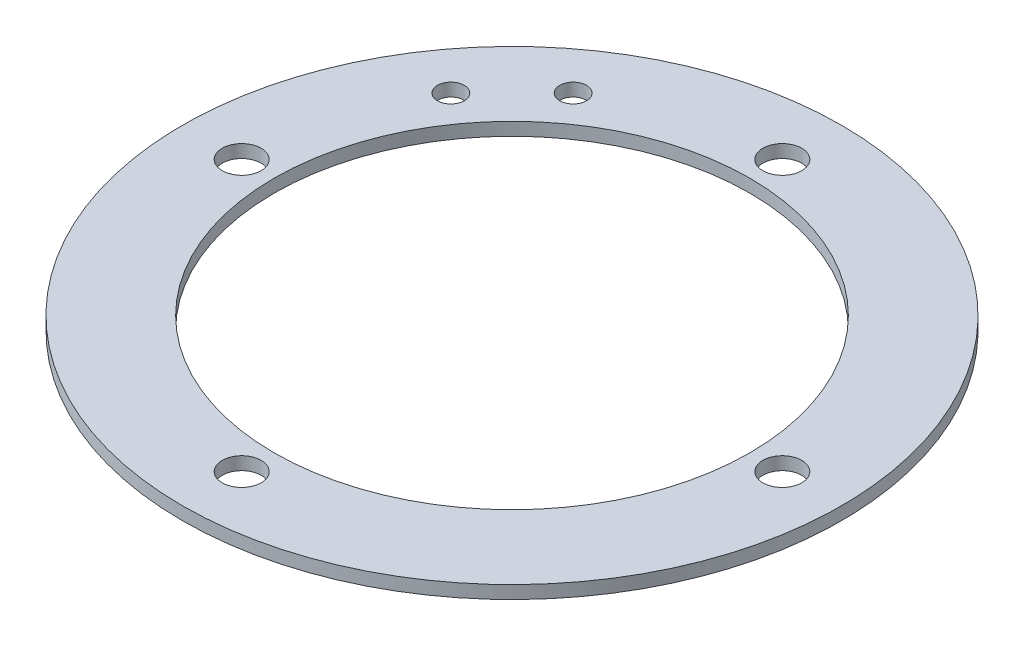
ISO-10303-21;
HEADER;
FILE_DESCRIPTION(('STEP AP214'),'2;1');
FILE_NAME('part.step','',(''),(''),'','','');
FILE_SCHEMA(('AUTOMOTIVE_DESIGN { 1 0 10303 214 1 1 1 1 }'));
ENDSEC;
DATA;
#1=APPLICATION_CONTEXT('core data for automotive mechanical design processes');
#2=APPLICATION_PROTOCOL_DEFINITION('international standard','automotive_design',2000,#1);
#3=PRODUCT_CONTEXT('',#1,'mechanical');
#4=PRODUCT('Part','Part','',(#3));
#5=PRODUCT_RELATED_PRODUCT_CATEGORY('part','',(#4));
#6=PRODUCT_DEFINITION_FORMATION('','',#4);
#7=PRODUCT_DEFINITION_CONTEXT('part definition',#1,'design');
#8=PRODUCT_DEFINITION('design','',#6,#7);
#9=PRODUCT_DEFINITION_SHAPE('','',#8);
#10=(LENGTH_UNIT() NAMED_UNIT(*) SI_UNIT(.MILLI.,.METRE.));
#11=(NAMED_UNIT(*) PLANE_ANGLE_UNIT() SI_UNIT($,.RADIAN.));
#12=(NAMED_UNIT(*) SI_UNIT($,.STERADIAN.) SOLID_ANGLE_UNIT());
#13=UNCERTAINTY_MEASURE_WITH_UNIT(LENGTH_MEASURE(1.E-05),#10,'distance_accuracy_value','');
#14=(GEOMETRIC_REPRESENTATION_CONTEXT(3) GLOBAL_UNCERTAINTY_ASSIGNED_CONTEXT((#13)) GLOBAL_UNIT_ASSIGNED_CONTEXT((#10,
#11,#12)) REPRESENTATION_CONTEXT('',''));
#15=CARTESIAN_POINT('',(0.,0.,0.));
#16=DIRECTION('',(0.,0.,1.));
#17=DIRECTION('',(1.,0.,0.));
#18=AXIS2_PLACEMENT_3D('',#15,#16,#17);
#19=CARTESIAN_POINT('',(0.,3.,0.));
#20=DIRECTION('',(0.,1.,0.));
#21=DIRECTION('',(0.,0.,1.));
#22=AXIS2_PLACEMENT_3D('',#19,#20,#21);
#23=PLANE('',#22);
#24=CARTESIAN_POINT('',(-51.6187950266179,3.,-37.4766594028871));
#25=DIRECTION('',(0.,1.,0.));
#26=DIRECTION('',(0.,0.,1.));
#27=AXIS2_PLACEMENT_3D('',#24,#25,#26);
#28=CIRCLE('',#27,3.09999999999999);
#29=CARTESIAN_POINT('',(-51.6187950266179,3.,-34.3766594028871));
#30=VERTEX_POINT('',#29);
#31=EDGE_CURVE('E84',#30,#30,#28,.T.);
#32=ORIENTED_EDGE('',*,*,#31,.F.);
#33=EDGE_LOOP('',(#32));
#34=FACE_BOUND('',#33,.T.);
#35=CARTESIAN_POINT('',(-37.4766594028869,3.,-51.618795026618));
#36=DIRECTION('',(0.,1.,0.));
#37=DIRECTION('',(0.,0.,1.));
#38=AXIS2_PLACEMENT_3D('',#35,#36,#37);
#39=CIRCLE('',#38,3.09999999999999);
#40=CARTESIAN_POINT('',(-37.4766594028869,3.,-48.518795026618));
#41=VERTEX_POINT('',#40);
#42=EDGE_CURVE('E78',#41,#41,#39,.T.);
#43=ORIENTED_EDGE('',*,*,#42,.F.);
#44=EDGE_LOOP('',(#43));
#45=FACE_BOUND('',#44,.T.);
#46=CARTESIAN_POINT('',(0.,3.,62.5));
#47=DIRECTION('',(0.,1.,0.));
#48=DIRECTION('',(0.,0.,1.));
#49=AXIS2_PLACEMENT_3D('',#46,#47,#48);
#50=CIRCLE('',#49,4.5);
#51=CARTESIAN_POINT('',(0.,3.,67.));
#52=VERTEX_POINT('',#51);
#53=EDGE_CURVE('E63',#52,#52,#50,.T.);
#54=ORIENTED_EDGE('',*,*,#53,.F.);
#55=EDGE_LOOP('',(#54));
#56=FACE_BOUND('',#55,.T.);
#57=CARTESIAN_POINT('',(0.,3.,0.));
#58=DIRECTION('',(0.,1.,0.));
#59=DIRECTION('',(0.,0.,1.));
#60=AXIS2_PLACEMENT_3D('',#57,#58,#59);
#61=CIRCLE('',#60,55.);
#62=CARTESIAN_POINT('',(0.,3.,55.));
#63=VERTEX_POINT('',#62);
#64=EDGE_CURVE('E51',#63,#63,#61,.T.);
#65=ORIENTED_EDGE('',*,*,#64,.F.);
#66=EDGE_LOOP('',(#65));
#67=FACE_BOUND('',#66,.T.);
#68=CARTESIAN_POINT('',(0.,3.,0.));
#69=DIRECTION('',(0.,1.,0.));
#70=DIRECTION('',(0.,0.,1.));
#71=AXIS2_PLACEMENT_3D('',#68,#69,#70);
#72=CIRCLE('',#71,76.2);
#73=CARTESIAN_POINT('',(0.,3.,76.2));
#74=VERTEX_POINT('',#73);
#75=EDGE_CURVE('E10',#74,#74,#72,.T.);
#76=ORIENTED_EDGE('',*,*,#75,.T.);
#77=EDGE_LOOP('',(#76));
#78=FACE_BOUND('',#77,.T.);
#79=CARTESIAN_POINT('',(0.,3.,-62.5));
#80=DIRECTION('',(0.,1.,0.));
#81=DIRECTION('',(0.,0.,1.));
#82=AXIS2_PLACEMENT_3D('',#79,#80,#81);
#83=CIRCLE('',#82,4.5);
#84=CARTESIAN_POINT('',(0.,3.,-58.));
#85=VERTEX_POINT('',#84);
#86=EDGE_CURVE('E46',#85,#85,#83,.T.);
#87=ORIENTED_EDGE('',*,*,#86,.F.);
#88=EDGE_LOOP('',(#87));
#89=FACE_BOUND('',#88,.T.);
#90=CARTESIAN_POINT('',(62.5,3.,0.));
#91=DIRECTION('',(0.,1.,0.));
#92=DIRECTION('',(0.,0.,1.));
#93=AXIS2_PLACEMENT_3D('',#90,#91,#92);
#94=CIRCLE('',#93,4.5);
#95=CARTESIAN_POINT('',(62.5,3.,4.5));
#96=VERTEX_POINT('',#95);
#97=EDGE_CURVE('E57',#96,#96,#94,.T.);
#98=ORIENTED_EDGE('',*,*,#97,.F.);
#99=EDGE_LOOP('',(#98));
#100=FACE_BOUND('',#99,.T.);
#101=CARTESIAN_POINT('',(-62.5,3.,0.));
#102=DIRECTION('',(0.,1.,0.));
#103=DIRECTION('',(0.,0.,1.));
#104=AXIS2_PLACEMENT_3D('',#101,#102,#103);
#105=CIRCLE('',#104,4.5);
#106=CARTESIAN_POINT('',(-62.5,3.,4.49999999999999));
#107=VERTEX_POINT('',#106);
#108=EDGE_CURVE('E69',#107,#107,#105,.T.);
#109=ORIENTED_EDGE('',*,*,#108,.F.);
#110=EDGE_LOOP('',(#109));
#111=FACE_BOUND('',#110,.T.);
#112=ADVANCED_FACE('F35',(#34,#45,#56,#67,#78,#89,#100,#111),#23,.T.);
#113=CARTESIAN_POINT('',(0.,0.,0.));
#114=DIRECTION('',(0.,1.,0.));
#115=DIRECTION('',(0.,0.,1.));
#116=AXIS2_PLACEMENT_3D('',#113,#114,#115);
#117=PLANE('',#116);
#118=CARTESIAN_POINT('',(-51.6187950266179,0.,-37.4766594028871));
#119=DIRECTION('',(0.,1.,0.));
#120=DIRECTION('',(0.,0.,1.));
#121=AXIS2_PLACEMENT_3D('',#118,#119,#120);
#122=CIRCLE('',#121,3.09999999999999);
#123=CARTESIAN_POINT('',(-51.6187950266179,0.,-34.3766594028871));
#124=VERTEX_POINT('',#123);
#125=EDGE_CURVE('E75',#124,#124,#122,.T.);
#126=ORIENTED_EDGE('',*,*,#125,.T.);
#127=EDGE_LOOP('',(#126));
#128=FACE_BOUND('',#127,.T.);
#129=CARTESIAN_POINT('',(-37.4766594028869,0.,-51.618795026618));
#130=DIRECTION('',(0.,1.,0.));
#131=DIRECTION('',(0.,0.,1.));
#132=AXIS2_PLACEMENT_3D('',#129,#130,#131);
#133=CIRCLE('',#132,3.09999999999999);
#134=CARTESIAN_POINT('',(-37.4766594028869,0.,-48.518795026618));
#135=VERTEX_POINT('',#134);
#136=EDGE_CURVE('E81',#135,#135,#133,.T.);
#137=ORIENTED_EDGE('',*,*,#136,.T.);
#138=EDGE_LOOP('',(#137));
#139=FACE_BOUND('',#138,.T.);
#140=CARTESIAN_POINT('',(0.,0.,0.));
#141=DIRECTION('',(0.,1.,0.));
#142=DIRECTION('',(0.,0.,1.));
#143=AXIS2_PLACEMENT_3D('',#140,#141,#142);
#144=CIRCLE('',#143,76.2);
#145=CARTESIAN_POINT('',(0.,0.,76.2));
#146=VERTEX_POINT('',#145);
#147=EDGE_CURVE('E39',#146,#146,#144,.T.);
#148=ORIENTED_EDGE('',*,*,#147,.F.);
#149=EDGE_LOOP('',(#148));
#150=FACE_BOUND('',#149,.T.);
#151=CARTESIAN_POINT('',(0.,0.,-62.5));
#152=DIRECTION('',(0.,1.,0.));
#153=DIRECTION('',(0.,0.,1.));
#154=AXIS2_PLACEMENT_3D('',#151,#152,#153);
#155=CIRCLE('',#154,4.5);
#156=CARTESIAN_POINT('',(0.,0.,-58.));
#157=VERTEX_POINT('',#156);
#158=EDGE_CURVE('E48',#157,#157,#155,.T.);
#159=ORIENTED_EDGE('',*,*,#158,.T.);
#160=EDGE_LOOP('',(#159));
#161=FACE_BOUND('',#160,.T.);
#162=CARTESIAN_POINT('',(0.,0.,0.));
#163=DIRECTION('',(0.,1.,0.));
#164=DIRECTION('',(0.,0.,1.));
#165=AXIS2_PLACEMENT_3D('',#162,#163,#164);
#166=CIRCLE('',#165,55.);
#167=CARTESIAN_POINT('',(0.,0.,55.));
#168=VERTEX_POINT('',#167);
#169=EDGE_CURVE('E54',#168,#168,#166,.T.);
#170=ORIENTED_EDGE('',*,*,#169,.T.);
#171=EDGE_LOOP('',(#170));
#172=FACE_BOUND('',#171,.T.);
#173=CARTESIAN_POINT('',(62.5,0.,0.));
#174=DIRECTION('',(0.,1.,0.));
#175=DIRECTION('',(0.,0.,1.));
#176=AXIS2_PLACEMENT_3D('',#173,#174,#175);
#177=CIRCLE('',#176,4.5);
#178=CARTESIAN_POINT('',(62.5,0.,4.5));
#179=VERTEX_POINT('',#178);
#180=EDGE_CURVE('E60',#179,#179,#177,.T.);
#181=ORIENTED_EDGE('',*,*,#180,.T.);
#182=EDGE_LOOP('',(#181));
#183=FACE_BOUND('',#182,.T.);
#184=CARTESIAN_POINT('',(0.,0.,62.5));
#185=DIRECTION('',(0.,1.,0.));
#186=DIRECTION('',(0.,0.,1.));
#187=AXIS2_PLACEMENT_3D('',#184,#185,#186);
#188=CIRCLE('',#187,4.5);
#189=CARTESIAN_POINT('',(0.,0.,67.));
#190=VERTEX_POINT('',#189);
#191=EDGE_CURVE('E66',#190,#190,#188,.T.);
#192=ORIENTED_EDGE('',*,*,#191,.T.);
#193=EDGE_LOOP('',(#192));
#194=FACE_BOUND('',#193,.T.);
#195=CARTESIAN_POINT('',(-62.5,0.,0.));
#196=DIRECTION('',(0.,1.,0.));
#197=DIRECTION('',(0.,0.,1.));
#198=AXIS2_PLACEMENT_3D('',#195,#196,#197);
#199=CIRCLE('',#198,4.5);
#200=CARTESIAN_POINT('',(-62.5,0.,4.49999999999999));
#201=VERTEX_POINT('',#200);
#202=EDGE_CURVE('E72',#201,#201,#199,.T.);
#203=ORIENTED_EDGE('',*,*,#202,.T.);
#204=EDGE_LOOP('',(#203));
#205=FACE_BOUND('',#204,.T.);
#206=ADVANCED_FACE('F90',(#128,#139,#150,#161,#172,#183,#194,#205),#117,.F.);
#207=CARTESIAN_POINT('',(0.,3.,0.));
#208=DIRECTION('',(0.,-1.,0.));
#209=DIRECTION('',(0.,0.,-1.));
#210=AXIS2_PLACEMENT_3D('',#207,#208,#209);
#211=CYLINDRICAL_SURFACE('',#210,76.2);
#212=ORIENTED_EDGE('',*,*,#75,.F.);
#213=EDGE_LOOP('',(#212));
#214=FACE_BOUND('',#213,.T.);
#215=ORIENTED_EDGE('',*,*,#147,.T.);
#216=EDGE_LOOP('',(#215));
#217=FACE_BOUND('',#216,.T.);
#218=ADVANCED_FACE('F37',(#214,#217),#211,.T.);
#219=CARTESIAN_POINT('',(0.,3.,-62.5));
#220=DIRECTION('',(0.,-1.,0.));
#221=DIRECTION('',(0.,0.,-1.));
#222=AXIS2_PLACEMENT_3D('',#219,#220,#221);
#223=CYLINDRICAL_SURFACE('',#222,4.5);
#224=ORIENTED_EDGE('',*,*,#86,.T.);
#225=EDGE_LOOP('',(#224));
#226=FACE_BOUND('',#225,.T.);
#227=ORIENTED_EDGE('',*,*,#158,.F.);
#228=EDGE_LOOP('',(#227));
#229=FACE_BOUND('',#228,.T.);
#230=ADVANCED_FACE('F126',(#226,#229),#223,.F.);
#231=CARTESIAN_POINT('',(0.,3.,0.));
#232=DIRECTION('',(0.,-1.,0.));
#233=DIRECTION('',(0.,0.,-1.));
#234=AXIS2_PLACEMENT_3D('',#231,#232,#233);
#235=CYLINDRICAL_SURFACE('',#234,55.);
#236=ORIENTED_EDGE('',*,*,#64,.T.);
#237=EDGE_LOOP('',(#236));
#238=FACE_BOUND('',#237,.T.);
#239=ORIENTED_EDGE('',*,*,#169,.F.);
#240=EDGE_LOOP('',(#239));
#241=FACE_BOUND('',#240,.T.);
#242=ADVANCED_FACE('F131',(#238,#241),#235,.F.);
#243=CARTESIAN_POINT('',(62.5,3.,0.));
#244=DIRECTION('',(0.,-1.,0.));
#245=DIRECTION('',(0.,0.,-1.));
#246=AXIS2_PLACEMENT_3D('',#243,#244,#245);
#247=CYLINDRICAL_SURFACE('',#246,4.5);
#248=ORIENTED_EDGE('',*,*,#97,.T.);
#249=EDGE_LOOP('',(#248));
#250=FACE_BOUND('',#249,.T.);
#251=ORIENTED_EDGE('',*,*,#180,.F.);
#252=EDGE_LOOP('',(#251));
#253=FACE_BOUND('',#252,.T.);
#254=ADVANCED_FACE('F135',(#250,#253),#247,.F.);
#255=CARTESIAN_POINT('',(0.,3.,62.5));
#256=DIRECTION('',(0.,-1.,0.));
#257=DIRECTION('',(0.,0.,-1.));
#258=AXIS2_PLACEMENT_3D('',#255,#256,#257);
#259=CYLINDRICAL_SURFACE('',#258,4.5);
#260=ORIENTED_EDGE('',*,*,#53,.T.);
#261=EDGE_LOOP('',(#260));
#262=FACE_BOUND('',#261,.T.);
#263=ORIENTED_EDGE('',*,*,#191,.F.);
#264=EDGE_LOOP('',(#263));
#265=FACE_BOUND('',#264,.T.);
#266=ADVANCED_FACE('F118',(#262,#265),#259,.F.);
#267=CARTESIAN_POINT('',(-62.5,3.,0.));
#268=DIRECTION('',(0.,-1.,0.));
#269=DIRECTION('',(0.,0.,-1.));
#270=AXIS2_PLACEMENT_3D('',#267,#268,#269);
#271=CYLINDRICAL_SURFACE('',#270,4.5);
#272=ORIENTED_EDGE('',*,*,#108,.T.);
#273=EDGE_LOOP('',(#272));
#274=FACE_BOUND('',#273,.T.);
#275=ORIENTED_EDGE('',*,*,#202,.F.);
#276=EDGE_LOOP('',(#275));
#277=FACE_BOUND('',#276,.T.);
#278=ADVANCED_FACE('F115',(#274,#277),#271,.F.);
#279=CARTESIAN_POINT('',(-37.4766594028869,0.,-51.618795026618));
#280=DIRECTION('',(0.,1.,0.));
#281=DIRECTION('',(0.,0.,1.));
#282=AXIS2_PLACEMENT_3D('',#279,#280,#281);
#283=CYLINDRICAL_SURFACE('',#282,3.09999999999999);
#284=ORIENTED_EDGE('',*,*,#136,.F.);
#285=EDGE_LOOP('',(#284));
#286=FACE_BOUND('',#285,.T.);
#287=ORIENTED_EDGE('',*,*,#42,.T.);
#288=EDGE_LOOP('',(#287));
#289=FACE_BOUND('',#288,.T.);
#290=ADVANCED_FACE('F96',(#286,#289),#283,.F.);
#291=CARTESIAN_POINT('',(-51.6187950266179,0.,-37.4766594028871));
#292=DIRECTION('',(0.,1.,0.));
#293=DIRECTION('',(0.,0.,1.));
#294=AXIS2_PLACEMENT_3D('',#291,#292,#293);
#295=CYLINDRICAL_SURFACE('',#294,3.09999999999999);
#296=ORIENTED_EDGE('',*,*,#125,.F.);
#297=EDGE_LOOP('',(#296));
#298=FACE_BOUND('',#297,.T.);
#299=ORIENTED_EDGE('',*,*,#31,.T.);
#300=EDGE_LOOP('',(#299));
#301=FACE_BOUND('',#300,.T.);
#302=ADVANCED_FACE('F93',(#298,#301),#295,.F.);
#303=CLOSED_SHELL('',(#112,#206,#218,#230,#242,#254,#266,#278,#290,#302));
#304=MANIFOLD_SOLID_BREP('B2',#303);
#305=ADVANCED_BREP_SHAPE_REPRESENTATION('',(#18,#304),#14);
#306=SHAPE_DEFINITION_REPRESENTATION(#9,#305);
ENDSEC;
END-ISO-10303-21;
